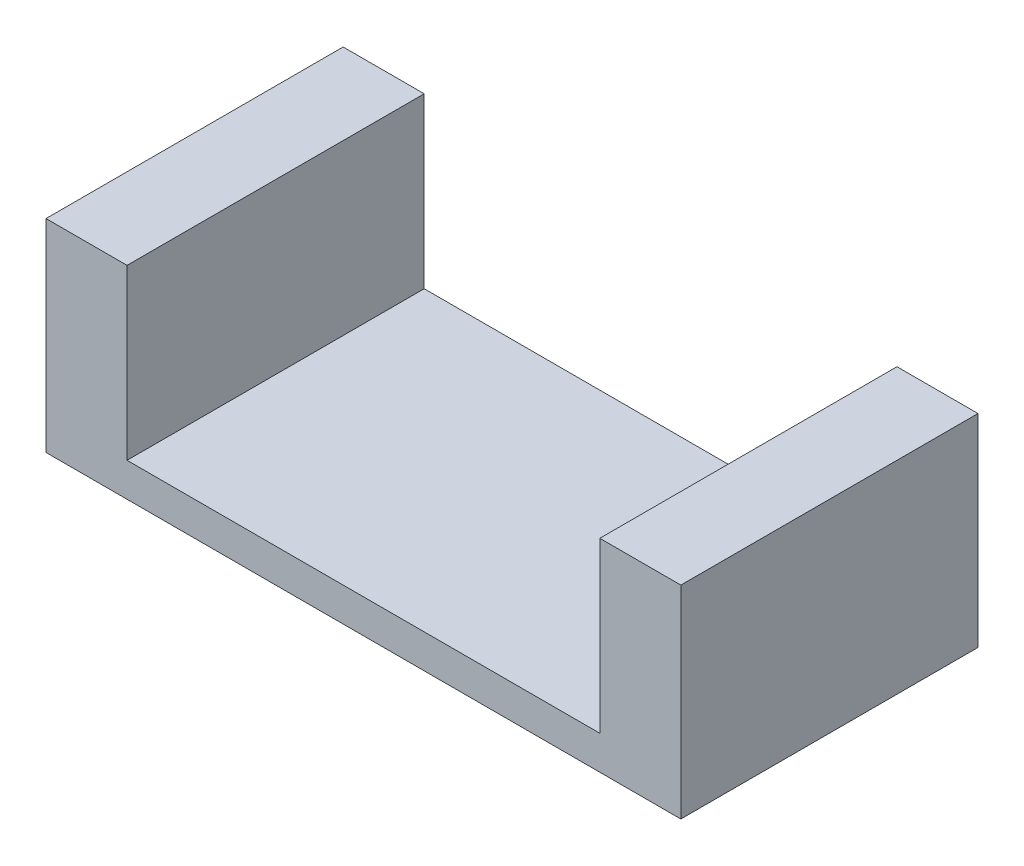
ISO-10303-21;
HEADER;
FILE_DESCRIPTION(('STEP AP214'),'2;1');
FILE_NAME('part.step','',(''),(''),'','','');
FILE_SCHEMA(('AUTOMOTIVE_DESIGN { 1 0 10303 214 1 1 1 1 }'));
ENDSEC;
DATA;
#1=APPLICATION_CONTEXT('core data for automotive mechanical design processes');
#2=APPLICATION_PROTOCOL_DEFINITION('international standard','automotive_design',2000,#1);
#3=PRODUCT_CONTEXT('',#1,'mechanical');
#4=PRODUCT('Part','Part','',(#3));
#5=PRODUCT_RELATED_PRODUCT_CATEGORY('part','',(#4));
#6=PRODUCT_DEFINITION_FORMATION('','',#4);
#7=PRODUCT_DEFINITION_CONTEXT('part definition',#1,'design');
#8=PRODUCT_DEFINITION('design','',#6,#7);
#9=PRODUCT_DEFINITION_SHAPE('','',#8);
#10=(LENGTH_UNIT() NAMED_UNIT(*) SI_UNIT(.MILLI.,.METRE.));
#11=(NAMED_UNIT(*) PLANE_ANGLE_UNIT() SI_UNIT($,.RADIAN.));
#12=(NAMED_UNIT(*) SI_UNIT($,.STERADIAN.) SOLID_ANGLE_UNIT());
#13=UNCERTAINTY_MEASURE_WITH_UNIT(LENGTH_MEASURE(1.E-05),#10,'distance_accuracy_value','');
#14=(GEOMETRIC_REPRESENTATION_CONTEXT(3) GLOBAL_UNCERTAINTY_ASSIGNED_CONTEXT((#13)) GLOBAL_UNIT_ASSIGNED_CONTEXT((#10,
#11,#12)) REPRESENTATION_CONTEXT('',''));
#15=CARTESIAN_POINT('',(0.,0.,0.));
#16=DIRECTION('',(0.,0.,1.));
#17=DIRECTION('',(1.,0.,0.));
#18=AXIS2_PLACEMENT_3D('',#15,#16,#17);
#19=CARTESIAN_POINT('',(7.84,2.25,2.31));
#20=DIRECTION('',(-1.,0.,0.));
#21=DIRECTION('',(0.,0.,-1.));
#22=AXIS2_PLACEMENT_3D('',#19,#20,#21);
#23=PLANE('',#22);
#24=DIRECTION('',(0.,0.,-1.));
#25=VECTOR('',#24,1.);
#26=CARTESIAN_POINT('',(7.84,2.25,2.09));
#27=LINE('',#26,#25);
#28=CARTESIAN_POINT('',(7.84,2.25,2.31));
#29=VERTEX_POINT('',#28);
#30=CARTESIAN_POINT('',(7.84,2.25,1.43));
#31=VERTEX_POINT('',#30);
#32=EDGE_CURVE('E137',#29,#31,#27,.T.);
#33=ORIENTED_EDGE('',*,*,#32,.F.);
#34=DIRECTION('',(0.,1.,0.));
#35=VECTOR('',#34,1.);
#36=CARTESIAN_POINT('',(7.84,1.95,2.31));
#37=LINE('',#36,#35);
#38=CARTESIAN_POINT('',(7.84,1.75,2.31));
#39=VERTEX_POINT('',#38);
#40=EDGE_CURVE('E36',#39,#29,#37,.T.);
#41=ORIENTED_EDGE('',*,*,#40,.F.);
#42=DIRECTION('',(0.,0.,-1.));
#43=VECTOR('',#42,1.);
#44=CARTESIAN_POINT('',(7.84,1.75,2.31));
#45=LINE('',#44,#43);
#46=CARTESIAN_POINT('',(7.84,1.75,1.43));
#47=VERTEX_POINT('',#46);
#48=EDGE_CURVE('E11',#39,#47,#45,.T.);
#49=ORIENTED_EDGE('',*,*,#48,.T.);
#50=DIRECTION('',(0.,-1.,0.));
#51=VECTOR('',#50,1.);
#52=CARTESIAN_POINT('',(7.84,1.95,1.43));
#53=LINE('',#52,#51);
#54=EDGE_CURVE('E125',#31,#47,#53,.T.);
#55=ORIENTED_EDGE('',*,*,#54,.F.);
#56=EDGE_LOOP('',(#33,#41,#49,#55));
#57=FACE_BOUND('',#56,.T.);
#58=ADVANCED_FACE('F17',(#57),#23,.F.);
#59=CARTESIAN_POINT('',(9.24,2.25,1.43));
#60=DIRECTION('',(1.,0.,0.));
#61=DIRECTION('',(0.,0.,1.));
#62=AXIS2_PLACEMENT_3D('',#59,#60,#61);
#63=PLANE('',#62);
#64=DIRECTION('',(0.,0.,1.));
#65=VECTOR('',#64,1.);
#66=CARTESIAN_POINT('',(9.24,2.25,1.65));
#67=LINE('',#66,#65);
#68=CARTESIAN_POINT('',(9.24,2.25,1.43));
#69=VERTEX_POINT('',#68);
#70=CARTESIAN_POINT('',(9.24,2.25,2.31));
#71=VERTEX_POINT('',#70);
#72=EDGE_CURVE('E130',#69,#71,#67,.T.);
#73=ORIENTED_EDGE('',*,*,#72,.F.);
#74=DIRECTION('',(0.,1.,0.));
#75=VECTOR('',#74,1.);
#76=CARTESIAN_POINT('',(9.24,1.95,1.43));
#77=LINE('',#76,#75);
#78=CARTESIAN_POINT('',(9.24,1.75,1.43));
#79=VERTEX_POINT('',#78);
#80=EDGE_CURVE('E105',#79,#69,#77,.T.);
#81=ORIENTED_EDGE('',*,*,#80,.F.);
#82=DIRECTION('',(0.,0.,1.));
#83=VECTOR('',#82,1.);
#84=CARTESIAN_POINT('',(9.24,1.75,1.43));
#85=LINE('',#84,#83);
#86=CARTESIAN_POINT('',(9.24,1.75,2.31));
#87=VERTEX_POINT('',#86);
#88=EDGE_CURVE('E27',#79,#87,#85,.T.);
#89=ORIENTED_EDGE('',*,*,#88,.T.);
#90=DIRECTION('',(0.,-1.,0.));
#91=VECTOR('',#90,1.);
#92=CARTESIAN_POINT('',(9.24,1.95,2.31));
#93=LINE('',#92,#91);
#94=EDGE_CURVE('E116',#71,#87,#93,.T.);
#95=ORIENTED_EDGE('',*,*,#94,.F.);
#96=EDGE_LOOP('',(#73,#81,#89,#95));
#97=FACE_BOUND('',#96,.T.);
#98=ADVANCED_FACE('F151',(#97),#63,.F.);
#99=CARTESIAN_POINT('',(8.54,1.75,1.87));
#100=DIRECTION('',(0.,-1.,0.));
#101=DIRECTION('',(0.,0.,-1.));
#102=AXIS2_PLACEMENT_3D('',#99,#100,#101);
#103=PLANE('',#102);
#104=DIRECTION('',(1.,0.,0.));
#105=VECTOR('',#104,1.);
#106=CARTESIAN_POINT('',(9.01,1.75,1.43));
#107=LINE('',#106,#105);
#108=EDGE_CURVE('E108',#47,#79,#107,.T.);
#109=ORIENTED_EDGE('',*,*,#108,.F.);
#110=ORIENTED_EDGE('',*,*,#48,.F.);
#111=DIRECTION('',(-1.,0.,0.));
#112=VECTOR('',#111,1.);
#113=CARTESIAN_POINT('',(8.07,1.75,2.31));
#114=LINE('',#113,#112);
#115=EDGE_CURVE('E94',#87,#39,#114,.T.);
#116=ORIENTED_EDGE('',*,*,#115,.F.);
#117=ORIENTED_EDGE('',*,*,#88,.F.);
#118=EDGE_LOOP('',(#109,#110,#116,#117));
#119=FACE_BOUND('',#118,.T.);
#120=ADVANCED_FACE('F155',(#119),#103,.F.);
#121=CARTESIAN_POINT('',(8.54,2.25,1.87));
#122=DIRECTION('',(0.,1.,0.));
#123=DIRECTION('',(0.,0.,1.));
#124=AXIS2_PLACEMENT_3D('',#121,#122,#123);
#125=PLANE('',#124);
#126=ORIENTED_EDGE('',*,*,#72,.T.);
#127=DIRECTION('',(1.,0.,0.));
#128=VECTOR('',#127,1.);
#129=CARTESIAN_POINT('',(9.48,2.25,2.31));
#130=LINE('',#129,#128);
#131=CARTESIAN_POINT('',(9.48,2.25,2.31));
#132=VERTEX_POINT('',#131);
#133=EDGE_CURVE('E127',#71,#132,#130,.T.);
#134=ORIENTED_EDGE('',*,*,#133,.T.);
#135=DIRECTION('',(0.,0.,-1.));
#136=VECTOR('',#135,1.);
#137=CARTESIAN_POINT('',(9.48,2.25,1.43));
#138=LINE('',#137,#136);
#139=CARTESIAN_POINT('',(9.48,2.25,1.43));
#140=VERTEX_POINT('',#139);
#141=EDGE_CURVE('E131',#132,#140,#138,.T.);
#142=ORIENTED_EDGE('',*,*,#141,.T.);
#143=DIRECTION('',(-1.,0.,0.));
#144=VECTOR('',#143,1.);
#145=CARTESIAN_POINT('',(7.6,2.25,1.43));
#146=LINE('',#145,#144);
#147=EDGE_CURVE('E134',#140,#69,#146,.T.);
#148=ORIENTED_EDGE('',*,*,#147,.T.);
#149=EDGE_LOOP('',(#126,#134,#142,#148));
#150=FACE_BOUND('',#149,.T.);
#151=ADVANCED_FACE('F170',(#150),#125,.T.);
#152=CARTESIAN_POINT('',(8.54,2.25,1.87));
#153=DIRECTION('',(0.,1.,0.));
#154=DIRECTION('',(0.,0.,1.));
#155=AXIS2_PLACEMENT_3D('',#152,#153,#154);
#156=PLANE('',#155);
#157=ORIENTED_EDGE('',*,*,#32,.T.);
#158=DIRECTION('',(-1.,0.,0.));
#159=VECTOR('',#158,1.);
#160=CARTESIAN_POINT('',(7.6,2.25,1.43));
#161=LINE('',#160,#159);
#162=CARTESIAN_POINT('',(7.6,2.25,1.43));
#163=VERTEX_POINT('',#162);
#164=EDGE_CURVE('E138',#31,#163,#161,.T.);
#165=ORIENTED_EDGE('',*,*,#164,.T.);
#166=DIRECTION('',(0.,0.,1.));
#167=VECTOR('',#166,1.);
#168=CARTESIAN_POINT('',(7.6,2.25,2.31));
#169=LINE('',#168,#167);
#170=CARTESIAN_POINT('',(7.6,2.25,2.31));
#171=VERTEX_POINT('',#170);
#172=EDGE_CURVE('E101',#163,#171,#169,.T.);
#173=ORIENTED_EDGE('',*,*,#172,.T.);
#174=DIRECTION('',(1.,0.,0.));
#175=VECTOR('',#174,1.);
#176=CARTESIAN_POINT('',(9.48,2.25,2.31));
#177=LINE('',#176,#175);
#178=EDGE_CURVE('E91',#171,#29,#177,.T.);
#179=ORIENTED_EDGE('',*,*,#178,.T.);
#180=EDGE_LOOP('',(#157,#165,#173,#179));
#181=FACE_BOUND('',#180,.T.);
#182=ADVANCED_FACE('F158',(#181),#156,.T.);
#183=CARTESIAN_POINT('',(9.48,1.65,1.43));
#184=DIRECTION('',(0.,0.,-1.));
#185=DIRECTION('',(-1.,0.,0.));
#186=AXIS2_PLACEMENT_3D('',#183,#184,#185);
#187=PLANE('',#186);
#188=ORIENTED_EDGE('',*,*,#54,.T.);
#189=ORIENTED_EDGE('',*,*,#108,.T.);
#190=ORIENTED_EDGE('',*,*,#80,.T.);
#191=ORIENTED_EDGE('',*,*,#147,.F.);
#192=DIRECTION('',(0.,1.,0.));
#193=VECTOR('',#192,1.);
#194=CARTESIAN_POINT('',(9.48,1.65,1.43));
#195=LINE('',#194,#193);
#196=CARTESIAN_POINT('',(9.48,1.65,1.43));
#197=VERTEX_POINT('',#196);
#198=EDGE_CURVE('E106',#197,#140,#195,.T.);
#199=ORIENTED_EDGE('',*,*,#198,.F.);
#200=DIRECTION('',(1.,0.,0.));
#201=VECTOR('',#200,1.);
#202=CARTESIAN_POINT('',(7.6,1.65,1.43));
#203=LINE('',#202,#201);
#204=CARTESIAN_POINT('',(7.6,1.65,1.43));
#205=VERTEX_POINT('',#204);
#206=EDGE_CURVE('E95',#205,#197,#203,.T.);
#207=ORIENTED_EDGE('',*,*,#206,.F.);
#208=DIRECTION('',(0.,1.,0.));
#209=VECTOR('',#208,1.);
#210=CARTESIAN_POINT('',(7.6,1.65,1.43));
#211=LINE('',#210,#209);
#212=EDGE_CURVE('E100',#205,#163,#211,.T.);
#213=ORIENTED_EDGE('',*,*,#212,.T.);
#214=ORIENTED_EDGE('',*,*,#164,.F.);
#215=EDGE_LOOP('',(#188,#189,#190,#191,#199,#207,#213,#214));
#216=FACE_BOUND('',#215,.T.);
#217=ADVANCED_FACE('F159',(#216),#187,.T.);
#218=CARTESIAN_POINT('',(9.48,1.65,2.31));
#219=DIRECTION('',(1.,0.,0.));
#220=DIRECTION('',(0.,0.,-1.));
#221=AXIS2_PLACEMENT_3D('',#218,#219,#220);
#222=PLANE('',#221);
#223=DIRECTION('',(0.,0.,1.));
#224=VECTOR('',#223,1.);
#225=CARTESIAN_POINT('',(9.48,1.65,1.43));
#226=LINE('',#225,#224);
#227=CARTESIAN_POINT('',(9.48,1.65,2.31));
#228=VERTEX_POINT('',#227);
#229=EDGE_CURVE('E79',#197,#228,#226,.T.);
#230=ORIENTED_EDGE('',*,*,#229,.F.);
#231=ORIENTED_EDGE('',*,*,#198,.T.);
#232=ORIENTED_EDGE('',*,*,#141,.F.);
#233=DIRECTION('',(0.,1.,0.));
#234=VECTOR('',#233,1.);
#235=CARTESIAN_POINT('',(9.48,1.65,2.31));
#236=LINE('',#235,#234);
#237=EDGE_CURVE('E115',#228,#132,#236,.T.);
#238=ORIENTED_EDGE('',*,*,#237,.F.);
#239=EDGE_LOOP('',(#230,#231,#232,#238));
#240=FACE_BOUND('',#239,.T.);
#241=ADVANCED_FACE('F161',(#240),#222,.T.);
#242=CARTESIAN_POINT('',(7.6,1.65,2.31));
#243=DIRECTION('',(0.,0.,1.));
#244=DIRECTION('',(1.,0.,0.));
#245=AXIS2_PLACEMENT_3D('',#242,#243,#244);
#246=PLANE('',#245);
#247=ORIENTED_EDGE('',*,*,#40,.T.);
#248=ORIENTED_EDGE('',*,*,#178,.F.);
#249=DIRECTION('',(0.,1.,0.));
#250=VECTOR('',#249,1.);
#251=CARTESIAN_POINT('',(7.6,1.65,2.31));
#252=LINE('',#251,#250);
#253=CARTESIAN_POINT('',(7.6,1.65,2.31));
#254=VERTEX_POINT('',#253);
#255=EDGE_CURVE('E88',#254,#171,#252,.T.);
#256=ORIENTED_EDGE('',*,*,#255,.F.);
#257=DIRECTION('',(-1.,0.,0.));
#258=VECTOR('',#257,1.);
#259=CARTESIAN_POINT('',(9.48,1.65,2.31));
#260=LINE('',#259,#258);
#261=EDGE_CURVE('E83',#228,#254,#260,.T.);
#262=ORIENTED_EDGE('',*,*,#261,.F.);
#263=ORIENTED_EDGE('',*,*,#237,.T.);
#264=ORIENTED_EDGE('',*,*,#133,.F.);
#265=ORIENTED_EDGE('',*,*,#94,.T.);
#266=ORIENTED_EDGE('',*,*,#115,.T.);
#267=EDGE_LOOP('',(#247,#248,#256,#262,#263,#264,#265,#266));
#268=FACE_BOUND('',#267,.T.);
#269=ADVANCED_FACE('F89',(#268),#246,.T.);
#270=CARTESIAN_POINT('',(7.6,1.65,1.43));
#271=DIRECTION('',(-1.,0.,0.));
#272=DIRECTION('',(0.,0.,1.));
#273=AXIS2_PLACEMENT_3D('',#270,#271,#272);
#274=PLANE('',#273);
#275=DIRECTION('',(0.,0.,-1.));
#276=VECTOR('',#275,1.);
#277=CARTESIAN_POINT('',(7.6,1.65,2.31));
#278=LINE('',#277,#276);
#279=EDGE_CURVE('E21',#254,#205,#278,.T.);
#280=ORIENTED_EDGE('',*,*,#279,.F.);
#281=ORIENTED_EDGE('',*,*,#255,.T.);
#282=ORIENTED_EDGE('',*,*,#172,.F.);
#283=ORIENTED_EDGE('',*,*,#212,.F.);
#284=EDGE_LOOP('',(#280,#281,#282,#283));
#285=FACE_BOUND('',#284,.T.);
#286=ADVANCED_FACE('F98',(#285),#274,.T.);
#287=CARTESIAN_POINT('',(8.54,1.65,1.87));
#288=DIRECTION('',(0.,1.,0.));
#289=DIRECTION('',(-1.,0.,0.));
#290=AXIS2_PLACEMENT_3D('',#287,#288,#289);
#291=PLANE('',#290);
#292=ORIENTED_EDGE('',*,*,#206,.T.);
#293=ORIENTED_EDGE('',*,*,#229,.T.);
#294=ORIENTED_EDGE('',*,*,#261,.T.);
#295=ORIENTED_EDGE('',*,*,#279,.T.);
#296=EDGE_LOOP('',(#292,#293,#294,#295));
#297=FACE_BOUND('',#296,.T.);
#298=ADVANCED_FACE('F19',(#297),#291,.F.);
#299=CLOSED_SHELL('',(#58,#98,#120,#151,#182,#217,#241,#269,#286,#298));
#300=MANIFOLD_SOLID_BREP('B1',#299);
#301=ADVANCED_BREP_SHAPE_REPRESENTATION('',(#18,#300),#14);
#302=SHAPE_DEFINITION_REPRESENTATION(#9,#301);
ENDSEC;
END-ISO-10303-21;
